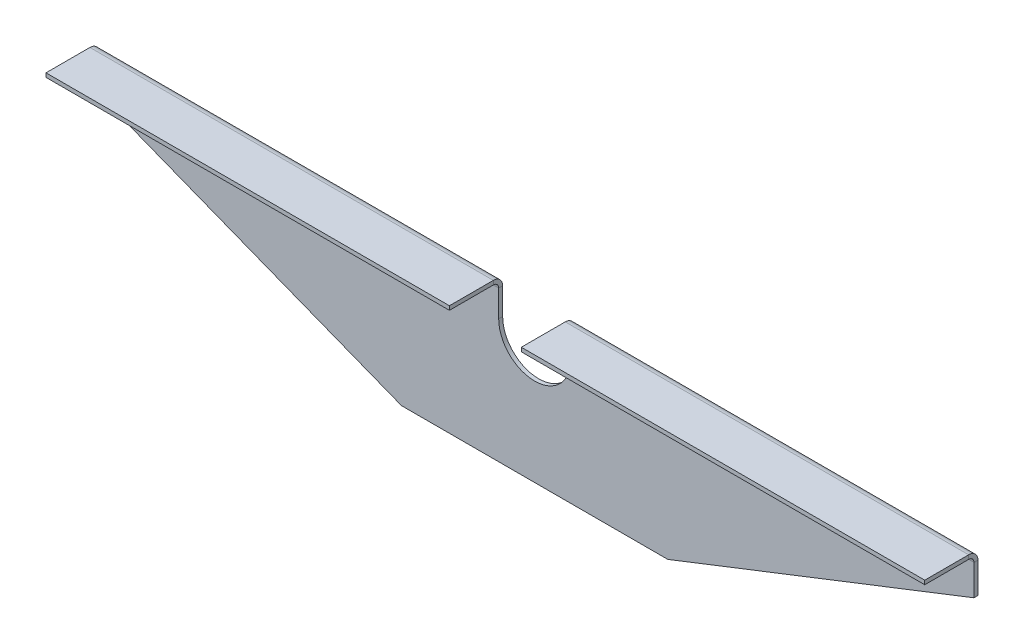
ISO-10303-21;
HEADER;
FILE_DESCRIPTION(('STEP AP214'),'2;1');
FILE_NAME('part.step','',(''),(''),'','','');
FILE_SCHEMA(('AUTOMOTIVE_DESIGN { 1 0 10303 214 1 1 1 1 }'));
ENDSEC;
DATA;
#1=APPLICATION_CONTEXT('core data for automotive mechanical design processes');
#2=APPLICATION_PROTOCOL_DEFINITION('international standard','automotive_design',2000,#1);
#3=PRODUCT_CONTEXT('',#1,'mechanical');
#4=PRODUCT('Part','Part','',(#3));
#5=PRODUCT_RELATED_PRODUCT_CATEGORY('part','',(#4));
#6=PRODUCT_DEFINITION_FORMATION('','',#4);
#7=PRODUCT_DEFINITION_CONTEXT('part definition',#1,'design');
#8=PRODUCT_DEFINITION('design','',#6,#7);
#9=PRODUCT_DEFINITION_SHAPE('','',#8);
#10=(LENGTH_UNIT() NAMED_UNIT(*) SI_UNIT(.MILLI.,.METRE.));
#11=(NAMED_UNIT(*) PLANE_ANGLE_UNIT() SI_UNIT($,.RADIAN.));
#12=(NAMED_UNIT(*) SI_UNIT($,.STERADIAN.) SOLID_ANGLE_UNIT());
#13=UNCERTAINTY_MEASURE_WITH_UNIT(LENGTH_MEASURE(1.E-05),#10,'distance_accuracy_value','');
#14=(GEOMETRIC_REPRESENTATION_CONTEXT(3) GLOBAL_UNCERTAINTY_ASSIGNED_CONTEXT((#13)) GLOBAL_UNIT_ASSIGNED_CONTEXT((#10,
#11,#12)) REPRESENTATION_CONTEXT('',''));
#15=CARTESIAN_POINT('',(0.,0.,0.));
#16=DIRECTION('',(0.,0.,1.));
#17=DIRECTION('',(1.,0.,0.));
#18=AXIS2_PLACEMENT_3D('',#15,#16,#17);
#19=CARTESIAN_POINT('',(-13.5,-3.50000000000003,-10.));
#20=DIRECTION('',(1.,0.,0.));
#21=DIRECTION('',(0.,0.,-1.));
#22=AXIS2_PLACEMENT_3D('',#19,#20,#21);
#23=PLANE('',#22);
#24=DIRECTION('',(0.,0.,-1.));
#25=VECTOR('',#24,1.);
#26=CARTESIAN_POINT('',(-13.5,8.49999999999998,0.));
#27=LINE('',#26,#25);
#28=CARTESIAN_POINT('',(-13.5,8.50000000000004,18.5));
#29=VERTEX_POINT('',#28);
#30=CARTESIAN_POINT('',(-13.5,8.49999999999999,2.));
#31=VERTEX_POINT('',#30);
#32=EDGE_CURVE('E479',#29,#31,#27,.T.);
#33=ORIENTED_EDGE('',*,*,#32,.T.);
#34=DIRECTION('',(0.,1.,0.));
#35=VECTOR('',#34,1.);
#36=CARTESIAN_POINT('',(-13.5,8.49999999999999,2.));
#37=LINE('',#36,#35);
#38=CARTESIAN_POINT('',(-13.5,9.99999999999998,2.));
#39=VERTEX_POINT('',#38);
#40=EDGE_CURVE('E13',#31,#39,#37,.T.);
#41=ORIENTED_EDGE('',*,*,#40,.T.);
#42=DIRECTION('',(0.,0.,-1.));
#43=VECTOR('',#42,1.);
#44=CARTESIAN_POINT('',(-13.5,9.99999999999998,0.));
#45=LINE('',#44,#43);
#46=CARTESIAN_POINT('',(-13.5,10.,18.5));
#47=VERTEX_POINT('',#46);
#48=EDGE_CURVE('E154',#47,#39,#45,.T.);
#49=ORIENTED_EDGE('',*,*,#48,.F.);
#50=DIRECTION('',(0.,1.,0.));
#51=VECTOR('',#50,1.);
#52=CARTESIAN_POINT('',(-13.5,10.,18.5));
#53=LINE('',#52,#51);
#54=EDGE_CURVE('E444',#29,#47,#53,.T.);
#55=ORIENTED_EDGE('',*,*,#54,.F.);
#56=EDGE_LOOP('',(#33,#41,#49,#55));
#57=FACE_BOUND('',#56,.T.);
#58=ADVANCED_FACE('F139',(#57),#23,.T.);
#59=DIRECTION('',(0.,-1.,0.));
#60=VECTOR('',#59,1.);
#61=CARTESIAN_POINT('',(-13.5,0.,-1.50000000000006));
#62=LINE('',#61,#60);
#63=CARTESIAN_POINT('',(-13.5,6.49999999999999,-1.50000000000006));
#64=VERTEX_POINT('',#63);
#65=CARTESIAN_POINT('',(-13.5,-3.50000000000003,-1.50000000000006));
#66=VERTEX_POINT('',#65);
#67=EDGE_CURVE('E282',#64,#66,#62,.T.);
#68=ORIENTED_EDGE('',*,*,#67,.F.);
#69=DIRECTION('',(0.,0.,1.));
#70=VECTOR('',#69,1.);
#71=CARTESIAN_POINT('',(-13.5,6.49999999999999,-1.50000000000006));
#72=LINE('',#71,#70);
#73=CARTESIAN_POINT('',(-13.5,6.49999999999999,0.));
#74=VERTEX_POINT('',#73);
#75=EDGE_CURVE('E148',#64,#74,#72,.T.);
#76=ORIENTED_EDGE('',*,*,#75,.T.);
#77=DIRECTION('',(0.,-1.,0.));
#78=VECTOR('',#77,1.);
#79=CARTESIAN_POINT('',(-13.5,0.,0.));
#80=LINE('',#79,#78);
#81=CARTESIAN_POINT('',(-13.5,-3.50000000000003,0.));
#82=VERTEX_POINT('',#81);
#83=EDGE_CURVE('E285',#74,#82,#80,.T.);
#84=ORIENTED_EDGE('',*,*,#83,.T.);
#85=DIRECTION('',(0.,0.,1.));
#86=VECTOR('',#85,1.);
#87=CARTESIAN_POINT('',(-13.5,-3.50000000000003,-10.));
#88=LINE('',#87,#86);
#89=EDGE_CURVE('E270',#66,#82,#88,.T.);
#90=ORIENTED_EDGE('',*,*,#89,.F.);
#91=EDGE_LOOP('',(#68,#76,#84,#90));
#92=FACE_BOUND('',#91,.T.);
#93=ADVANCED_FACE('F281',(#92),#23,.T.);
#94=CARTESIAN_POINT('',(13.5,-3.50000000000002,-10.));
#95=DIRECTION('',(1.,0.,0.));
#96=DIRECTION('',(0.,0.,-1.));
#97=AXIS2_PLACEMENT_3D('',#94,#95,#96);
#98=PLANE('',#97);
#99=DIRECTION('',(0.,0.,-1.));
#100=VECTOR('',#99,1.);
#101=CARTESIAN_POINT('',(13.5,9.99999999999998,0.));
#102=LINE('',#101,#100);
#103=CARTESIAN_POINT('',(13.5,10.,18.5));
#104=VERTEX_POINT('',#103);
#105=CARTESIAN_POINT('',(13.5,9.99999999999998,2.));
#106=VERTEX_POINT('',#105);
#107=EDGE_CURVE('E312',#104,#106,#102,.T.);
#108=ORIENTED_EDGE('',*,*,#107,.T.);
#109=DIRECTION('',(0.,-1.,0.));
#110=VECTOR('',#109,1.);
#111=CARTESIAN_POINT('',(13.5,9.99999999999998,2.));
#112=LINE('',#111,#110);
#113=CARTESIAN_POINT('',(13.5,8.49999999999998,2.));
#114=VERTEX_POINT('',#113);
#115=EDGE_CURVE('E465',#106,#114,#112,.T.);
#116=ORIENTED_EDGE('',*,*,#115,.T.);
#117=DIRECTION('',(0.,0.,-1.));
#118=VECTOR('',#117,1.);
#119=CARTESIAN_POINT('',(13.5,8.49999999999998,0.));
#120=LINE('',#119,#118);
#121=CARTESIAN_POINT('',(13.5,8.50000000000004,18.5));
#122=VERTEX_POINT('',#121);
#123=EDGE_CURVE('E293',#122,#114,#120,.T.);
#124=ORIENTED_EDGE('',*,*,#123,.F.);
#125=DIRECTION('',(0.,1.,0.));
#126=VECTOR('',#125,1.);
#127=CARTESIAN_POINT('',(13.5,10.,18.5));
#128=LINE('',#127,#126);
#129=EDGE_CURVE('E456',#122,#104,#128,.T.);
#130=ORIENTED_EDGE('',*,*,#129,.T.);
#131=EDGE_LOOP('',(#108,#116,#124,#130));
#132=FACE_BOUND('',#131,.T.);
#133=ADVANCED_FACE('F624',(#132),#98,.F.);
#134=DIRECTION('',(0.,-1.,0.));
#135=VECTOR('',#134,1.);
#136=CARTESIAN_POINT('',(13.5,0.,0.));
#137=LINE('',#136,#135);
#138=CARTESIAN_POINT('',(13.5,6.49999999999998,0.));
#139=VERTEX_POINT('',#138);
#140=CARTESIAN_POINT('',(13.5,-3.50000000000003,0.));
#141=VERTEX_POINT('',#140);
#142=EDGE_CURVE('E308',#139,#141,#137,.T.);
#143=ORIENTED_EDGE('',*,*,#142,.F.);
#144=DIRECTION('',(0.,0.,-1.));
#145=VECTOR('',#144,1.);
#146=CARTESIAN_POINT('',(13.5,6.49999999999998,0.));
#147=LINE('',#146,#145);
#148=CARTESIAN_POINT('',(13.5,6.49999999999998,-1.50000000000006));
#149=VERTEX_POINT('',#148);
#150=EDGE_CURVE('E462',#139,#149,#147,.T.);
#151=ORIENTED_EDGE('',*,*,#150,.T.);
#152=DIRECTION('',(0.,-1.,0.));
#153=VECTOR('',#152,1.);
#154=CARTESIAN_POINT('',(13.5,0.,-1.50000000000006));
#155=LINE('',#154,#153);
#156=CARTESIAN_POINT('',(13.5,-3.50000000000003,-1.50000000000006));
#157=VERTEX_POINT('',#156);
#158=EDGE_CURVE('E277',#149,#157,#155,.T.);
#159=ORIENTED_EDGE('',*,*,#158,.T.);
#160=DIRECTION('',(0.,0.,1.));
#161=VECTOR('',#160,1.);
#162=CARTESIAN_POINT('',(13.5,-3.50000000000002,-10.));
#163=LINE('',#162,#161);
#164=EDGE_CURVE('E273',#157,#141,#163,.T.);
#165=ORIENTED_EDGE('',*,*,#164,.T.);
#166=EDGE_LOOP('',(#143,#151,#159,#165));
#167=FACE_BOUND('',#166,.T.);
#168=ADVANCED_FACE('F575',(#167),#98,.F.);
#169=CARTESIAN_POINT('',(-165.,6.49999999999999,2.));
#170=DIRECTION('',(-1.,0.,0.));
#171=DIRECTION('',(0.,1.,0.));
#172=AXIS2_PLACEMENT_3D('',#169,#170,#171);
#173=CYLINDRICAL_SURFACE('',#172,3.5);
#174=DIRECTION('',(-1.,0.,0.));
#175=VECTOR('',#174,1.);
#176=CARTESIAN_POINT('',(0.,9.99999999999998,2.));
#177=LINE('',#176,#175);
#178=CARTESIAN_POINT('',(-165.,9.99999999999998,2.));
#179=VERTEX_POINT('',#178);
#180=EDGE_CURVE('E359',#39,#179,#177,.T.);
#181=ORIENTED_EDGE('',*,*,#180,.F.);
#182=CARTESIAN_POINT('',(-13.5,6.49999999999999,2.));
#183=DIRECTION('',(1.,0.,0.));
#184=DIRECTION('',(0.,0.,-1.));
#185=AXIS2_PLACEMENT_3D('',#182,#183,#184);
#186=CIRCLE('',#185,3.5);
#187=EDGE_CURVE('E294',#39,#64,#186,.F.);
#188=ORIENTED_EDGE('',*,*,#187,.T.);
#189=DIRECTION('',(-1.,0.,0.));
#190=VECTOR('',#189,1.);
#191=CARTESIAN_POINT('',(-165.,6.49999999999999,-1.50000000000006));
#192=LINE('',#191,#190);
#193=CARTESIAN_POINT('',(-165.,6.49999999999999,-1.50000000000006));
#194=VERTEX_POINT('',#193);
#195=EDGE_CURVE('E291',#194,#64,#192,.F.);
#196=ORIENTED_EDGE('',*,*,#195,.F.);
#197=CARTESIAN_POINT('',(-165.,6.49999999999999,2.));
#198=DIRECTION('',(-1.,0.,0.));
#199=DIRECTION('',(0.,0.,1.));
#200=AXIS2_PLACEMENT_3D('',#197,#198,#199);
#201=CIRCLE('',#200,3.5);
#202=EDGE_CURVE('E379',#179,#194,#201,.T.);
#203=ORIENTED_EDGE('',*,*,#202,.F.);
#204=EDGE_LOOP('',(#181,#188,#196,#203));
#205=FACE_BOUND('',#204,.T.);
#206=ADVANCED_FACE('F509',(#205),#173,.T.);
#207=CARTESIAN_POINT('',(-165.,6.49999999999999,2.));
#208=DIRECTION('',(-1.,0.,0.));
#209=DIRECTION('',(0.,1.,0.));
#210=AXIS2_PLACEMENT_3D('',#207,#208,#209);
#211=CYLINDRICAL_SURFACE('',#210,2.);
#212=CARTESIAN_POINT('',(-13.5,6.49999999999999,2.));
#213=DIRECTION('',(1.,0.,0.));
#214=DIRECTION('',(0.,0.,-1.));
#215=AXIS2_PLACEMENT_3D('',#212,#213,#214);
#216=CIRCLE('',#215,2.);
#217=EDGE_CURVE('E473',#31,#74,#216,.F.);
#218=ORIENTED_EDGE('',*,*,#217,.F.);
#219=DIRECTION('',(1.,0.,0.));
#220=VECTOR('',#219,1.);
#221=CARTESIAN_POINT('',(165.,8.49999999999998,2.));
#222=LINE('',#221,#220);
#223=CARTESIAN_POINT('',(-165.,8.49999999999998,2.));
#224=VERTEX_POINT('',#223);
#225=EDGE_CURVE('E368',#31,#224,#222,.F.);
#226=ORIENTED_EDGE('',*,*,#225,.T.);
#227=CARTESIAN_POINT('',(-165.,6.49999999999999,2.));
#228=DIRECTION('',(-1.,0.,0.));
#229=DIRECTION('',(0.,0.,1.));
#230=AXIS2_PLACEMENT_3D('',#227,#228,#229);
#231=CIRCLE('',#230,2.);
#232=CARTESIAN_POINT('',(-165.,6.49999999999999,0.));
#233=VERTEX_POINT('',#232);
#234=EDGE_CURVE('E326',#224,#233,#231,.T.);
#235=ORIENTED_EDGE('',*,*,#234,.T.);
#236=DIRECTION('',(-1.,0.,0.));
#237=VECTOR('',#236,1.);
#238=CARTESIAN_POINT('',(-165.,6.49999999999999,0.));
#239=LINE('',#238,#237);
#240=EDGE_CURVE('E387',#233,#74,#239,.F.);
#241=ORIENTED_EDGE('',*,*,#240,.T.);
#242=EDGE_LOOP('',(#218,#226,#235,#241));
#243=FACE_BOUND('',#242,.T.);
#244=ADVANCED_FACE('F488',(#243),#211,.F.);
#245=CARTESIAN_POINT('',(0.,9.99999999999998,0.));
#246=DIRECTION('',(0.,1.,0.));
#247=DIRECTION('',(0.,0.,1.));
#248=AXIS2_PLACEMENT_3D('',#245,#246,#247);
#249=PLANE('',#248);
#250=DIRECTION('',(-1.,0.,0.));
#251=VECTOR('',#250,1.);
#252=CARTESIAN_POINT('',(-165.,10.,18.5));
#253=LINE('',#252,#251);
#254=CARTESIAN_POINT('',(-165.,10.,18.5));
#255=VERTEX_POINT('',#254);
#256=EDGE_CURVE('E339',#47,#255,#253,.T.);
#257=ORIENTED_EDGE('',*,*,#256,.F.);
#258=ORIENTED_EDGE('',*,*,#48,.T.);
#259=ORIENTED_EDGE('',*,*,#180,.T.);
#260=DIRECTION('',(0.,0.,-1.));
#261=VECTOR('',#260,1.);
#262=CARTESIAN_POINT('',(-165.,9.99999999999998,0.));
#263=LINE('',#262,#261);
#264=EDGE_CURVE('E331',#255,#179,#263,.T.);
#265=ORIENTED_EDGE('',*,*,#264,.F.);
#266=EDGE_LOOP('',(#257,#258,#259,#265));
#267=FACE_BOUND('',#266,.T.);
#268=ADVANCED_FACE('F504',(#267),#249,.T.);
#269=CARTESIAN_POINT('',(0.,8.49999999999998,0.));
#270=DIRECTION('',(0.,1.,0.));
#271=DIRECTION('',(0.,0.,1.));
#272=AXIS2_PLACEMENT_3D('',#269,#270,#271);
#273=PLANE('',#272);
#274=ORIENTED_EDGE('',*,*,#32,.F.);
#275=DIRECTION('',(1.,0.,0.));
#276=VECTOR('',#275,1.);
#277=CARTESIAN_POINT('',(0.,8.50000000000004,18.5));
#278=LINE('',#277,#276);
#279=CARTESIAN_POINT('',(-165.,8.50000000000004,18.5));
#280=VERTEX_POINT('',#279);
#281=EDGE_CURVE('E351',#29,#280,#278,.F.);
#282=ORIENTED_EDGE('',*,*,#281,.T.);
#283=DIRECTION('',(0.,0.,1.));
#284=VECTOR('',#283,1.);
#285=CARTESIAN_POINT('',(-165.,8.49999999999998,0.));
#286=LINE('',#285,#284);
#287=EDGE_CURVE('E343',#280,#224,#286,.F.);
#288=ORIENTED_EDGE('',*,*,#287,.T.);
#289=ORIENTED_EDGE('',*,*,#225,.F.);
#290=EDGE_LOOP('',(#274,#282,#288,#289));
#291=FACE_BOUND('',#290,.T.);
#292=ADVANCED_FACE('F496',(#291),#273,.F.);
#293=CARTESIAN_POINT('',(-165.,10.,18.5));
#294=DIRECTION('',(0.,0.,1.));
#295=DIRECTION('',(0.,-1.,0.));
#296=AXIS2_PLACEMENT_3D('',#293,#294,#295);
#297=PLANE('',#296);
#298=ORIENTED_EDGE('',*,*,#281,.F.);
#299=ORIENTED_EDGE('',*,*,#54,.T.);
#300=ORIENTED_EDGE('',*,*,#256,.T.);
#301=DIRECTION('',(0.,-1.,0.));
#302=VECTOR('',#301,1.);
#303=CARTESIAN_POINT('',(-165.,10.,18.5));
#304=LINE('',#303,#302);
#305=EDGE_CURVE('E322',#255,#280,#304,.T.);
#306=ORIENTED_EDGE('',*,*,#305,.T.);
#307=EDGE_LOOP('',(#298,#299,#300,#306));
#308=FACE_BOUND('',#307,.T.);
#309=ADVANCED_FACE('F562',(#308),#297,.T.);
#310=CARTESIAN_POINT('',(-165.,-5.00000000000002,-1.50000000000006));
#311=DIRECTION('',(-1.,0.,0.));
#312=DIRECTION('',(0.,0.,1.));
#313=AXIS2_PLACEMENT_3D('',#310,#311,#312);
#314=PLANE('',#313);
#315=DIRECTION('',(0.,-1.,0.));
#316=VECTOR('',#315,1.);
#317=CARTESIAN_POINT('',(-165.,-5.00000000000002,0.));
#318=LINE('',#317,#316);
#319=CARTESIAN_POINT('',(-165.,-5.00000000000002,0.));
#320=VERTEX_POINT('',#319);
#321=EDGE_CURVE('E399',#233,#320,#318,.T.);
#322=ORIENTED_EDGE('',*,*,#321,.F.);
#323=DIRECTION('',(0.,0.,-1.));
#324=VECTOR('',#323,1.);
#325=CARTESIAN_POINT('',(-165.,6.49999999999999,0.));
#326=LINE('',#325,#324);
#327=EDGE_CURVE('E378',#233,#194,#326,.T.);
#328=ORIENTED_EDGE('',*,*,#327,.T.);
#329=DIRECTION('',(0.,-1.,0.));
#330=VECTOR('',#329,1.);
#331=CARTESIAN_POINT('',(-165.,-5.00000000000002,-1.50000000000006));
#332=LINE('',#331,#330);
#333=CARTESIAN_POINT('',(-165.,-5.00000000000002,-1.50000000000006));
#334=VERTEX_POINT('',#333);
#335=EDGE_CURVE('E403',#194,#334,#332,.T.);
#336=ORIENTED_EDGE('',*,*,#335,.T.);
#337=DIRECTION('',(0.,0.,1.));
#338=VECTOR('',#337,1.);
#339=CARTESIAN_POINT('',(-165.,-5.00000000000002,-1.50000000000006));
#340=LINE('',#339,#338);
#341=EDGE_CURVE('E423',#334,#320,#340,.T.);
#342=ORIENTED_EDGE('',*,*,#341,.T.);
#343=EDGE_LOOP('',(#322,#328,#336,#342));
#344=FACE_BOUND('',#343,.T.);
#345=ADVANCED_FACE('F141',(#344),#314,.T.);
#346=CARTESIAN_POINT('',(0.,0.,-1.50000000000006));
#347=DIRECTION('',(0.,0.,-1.));
#348=DIRECTION('',(-1.,0.,0.));
#349=AXIS2_PLACEMENT_3D('',#346,#347,#348);
#350=PLANE('',#349);
#351=ORIENTED_EDGE('',*,*,#158,.F.);
#352=CARTESIAN_POINT('',(165.,6.49999999999997,-1.50000000000006));
#353=VERTEX_POINT('',#352);
#354=EDGE_CURVE('E162',#149,#353,#192,.F.);
#355=ORIENTED_EDGE('',*,*,#354,.T.);
#356=DIRECTION('',(0.,1.,0.));
#357=VECTOR('',#356,1.);
#358=CARTESIAN_POINT('',(165.,9.99999999999998,-1.50000000000006));
#359=LINE('',#358,#357);
#360=CARTESIAN_POINT('',(165.,-5.00000000000003,-1.50000000000006));
#361=VERTEX_POINT('',#360);
#362=EDGE_CURVE('E419',#361,#353,#359,.T.);
#363=ORIENTED_EDGE('',*,*,#362,.F.);
#364=DIRECTION('',(0.931242779705753,0.364399348580512,0.));
#365=VECTOR('',#364,1.);
#366=CARTESIAN_POINT('',(165.,-5.00000000000003,-1.50000000000006));
#367=LINE('',#366,#365);
#368=CARTESIAN_POINT('',(50.,-50.,-1.50000000000006));
#369=VERTEX_POINT('',#368);
#370=EDGE_CURVE('E415',#369,#361,#367,.T.);
#371=ORIENTED_EDGE('',*,*,#370,.F.);
#372=DIRECTION('',(1.,0.,0.));
#373=VECTOR('',#372,1.);
#374=CARTESIAN_POINT('',(50.,-50.,-1.50000000000006));
#375=LINE('',#374,#373);
#376=CARTESIAN_POINT('',(-50.,-50.,-1.50000000000006));
#377=VERTEX_POINT('',#376);
#378=EDGE_CURVE('E411',#377,#369,#375,.T.);
#379=ORIENTED_EDGE('',*,*,#378,.F.);
#380=DIRECTION('',(0.931242779705753,-0.364399348580512,0.));
#381=VECTOR('',#380,1.);
#382=CARTESIAN_POINT('',(-50.,-50.,-1.50000000000006));
#383=LINE('',#382,#381);
#384=EDGE_CURVE('E406',#334,#377,#383,.T.);
#385=ORIENTED_EDGE('',*,*,#384,.F.);
#386=ORIENTED_EDGE('',*,*,#335,.F.);
#387=ORIENTED_EDGE('',*,*,#195,.T.);
#388=ORIENTED_EDGE('',*,*,#67,.T.);
#389=CARTESIAN_POINT('',(0.,-3.50000000000003,-1.50000000000006));
#390=DIRECTION('',(0.,0.,-1.));
#391=DIRECTION('',(-1.,0.,0.));
#392=AXIS2_PLACEMENT_3D('',#389,#390,#391);
#393=CIRCLE('',#392,13.5);
#394=EDGE_CURVE('E267',#157,#66,#393,.T.);
#395=ORIENTED_EDGE('',*,*,#394,.F.);
#396=EDGE_LOOP('',(#351,#355,#363,#371,#379,#385,#386,#387,#388,#395));
#397=FACE_BOUND('',#396,.T.);
#398=ADVANCED_FACE('F289',(#397),#350,.T.);
#399=CARTESIAN_POINT('',(0.,0.,0.));
#400=DIRECTION('',(0.,0.,-1.));
#401=DIRECTION('',(-1.,0.,0.));
#402=AXIS2_PLACEMENT_3D('',#399,#400,#401);
#403=PLANE('',#402);
#404=CARTESIAN_POINT('',(165.,6.49999999999997,0.));
#405=VERTEX_POINT('',#404);
#406=EDGE_CURVE('E391',#139,#405,#239,.F.);
#407=ORIENTED_EDGE('',*,*,#406,.F.);
#408=ORIENTED_EDGE('',*,*,#142,.T.);
#409=CARTESIAN_POINT('',(0.,-3.50000000000003,0.));
#410=DIRECTION('',(0.,0.,-1.));
#411=DIRECTION('',(-1.,0.,0.));
#412=AXIS2_PLACEMENT_3D('',#409,#410,#411);
#413=CIRCLE('',#412,13.5);
#414=EDGE_CURVE('E459',#141,#82,#413,.T.);
#415=ORIENTED_EDGE('',*,*,#414,.T.);
#416=ORIENTED_EDGE('',*,*,#83,.F.);
#417=ORIENTED_EDGE('',*,*,#240,.F.);
#418=ORIENTED_EDGE('',*,*,#321,.T.);
#419=DIRECTION('',(0.931242779705753,-0.364399348580512,0.));
#420=VECTOR('',#419,1.);
#421=CARTESIAN_POINT('',(-50.,-50.,0.));
#422=LINE('',#421,#420);
#423=CARTESIAN_POINT('',(-50.,-50.,0.));
#424=VERTEX_POINT('',#423);
#425=EDGE_CURVE('E426',#320,#424,#422,.T.);
#426=ORIENTED_EDGE('',*,*,#425,.T.);
#427=DIRECTION('',(1.,0.,0.));
#428=VECTOR('',#427,1.);
#429=CARTESIAN_POINT('',(50.,-50.,0.));
#430=LINE('',#429,#428);
#431=CARTESIAN_POINT('',(50.,-50.,0.));
#432=VERTEX_POINT('',#431);
#433=EDGE_CURVE('E430',#424,#432,#430,.T.);
#434=ORIENTED_EDGE('',*,*,#433,.T.);
#435=DIRECTION('',(0.931242779705753,0.364399348580512,0.));
#436=VECTOR('',#435,1.);
#437=CARTESIAN_POINT('',(165.,-5.00000000000003,0.));
#438=LINE('',#437,#436);
#439=CARTESIAN_POINT('',(165.,-5.00000000000003,0.));
#440=VERTEX_POINT('',#439);
#441=EDGE_CURVE('E434',#432,#440,#438,.T.);
#442=ORIENTED_EDGE('',*,*,#441,.T.);
#443=DIRECTION('',(0.,1.,0.));
#444=VECTOR('',#443,1.);
#445=CARTESIAN_POINT('',(165.,9.99999999999998,0.));
#446=LINE('',#445,#444);
#447=EDGE_CURVE('E407',#440,#405,#446,.T.);
#448=ORIENTED_EDGE('',*,*,#447,.T.);
#449=EDGE_LOOP('',(#407,#408,#415,#416,#417,#418,#426,#434,#442,#448));
#450=FACE_BOUND('',#449,.T.);
#451=ADVANCED_FACE('F484',(#450),#403,.F.);
#452=CARTESIAN_POINT('',(165.,9.99999999999998,-1.50000000000006));
#453=DIRECTION('',(1.,0.,0.));
#454=DIRECTION('',(0.,1.,0.));
#455=AXIS2_PLACEMENT_3D('',#452,#453,#454);
#456=PLANE('',#455);
#457=DIRECTION('',(0.,0.,-1.));
#458=VECTOR('',#457,1.);
#459=CARTESIAN_POINT('',(165.,6.49999999999997,0.));
#460=LINE('',#459,#458);
#461=EDGE_CURVE('E395',#405,#353,#460,.T.);
#462=ORIENTED_EDGE('',*,*,#461,.F.);
#463=ORIENTED_EDGE('',*,*,#447,.F.);
#464=DIRECTION('',(0.,0.,1.));
#465=VECTOR('',#464,1.);
#466=CARTESIAN_POINT('',(165.,-5.00000000000003,-1.50000000000006));
#467=LINE('',#466,#465);
#468=EDGE_CURVE('E441',#361,#440,#467,.T.);
#469=ORIENTED_EDGE('',*,*,#468,.F.);
#470=ORIENTED_EDGE('',*,*,#362,.T.);
#471=EDGE_LOOP('',(#462,#463,#469,#470));
#472=FACE_BOUND('',#471,.T.);
#473=ADVANCED_FACE('F527',(#472),#456,.T.);
#474=CARTESIAN_POINT('',(165.,-5.00000000000003,-1.50000000000006));
#475=DIRECTION('',(0.364399348580512,-0.931242779705753,0.));
#476=DIRECTION('',(0.931242779705754,0.364399348580512,0.));
#477=AXIS2_PLACEMENT_3D('',#474,#475,#476);
#478=PLANE('',#477);
#479=ORIENTED_EDGE('',*,*,#441,.F.);
#480=DIRECTION('',(0.,0.,1.));
#481=VECTOR('',#480,1.);
#482=CARTESIAN_POINT('',(50.,-50.,-1.50000000000006));
#483=LINE('',#482,#481);
#484=EDGE_CURVE('E445',#369,#432,#483,.T.);
#485=ORIENTED_EDGE('',*,*,#484,.F.);
#486=ORIENTED_EDGE('',*,*,#370,.T.);
#487=ORIENTED_EDGE('',*,*,#468,.T.);
#488=EDGE_LOOP('',(#479,#485,#486,#487));
#489=FACE_BOUND('',#488,.T.);
#490=ADVANCED_FACE('F523',(#489),#478,.T.);
#491=CARTESIAN_POINT('',(50.,-50.,-1.50000000000006));
#492=DIRECTION('',(0.,-1.,0.));
#493=DIRECTION('',(0.,0.,-1.));
#494=AXIS2_PLACEMENT_3D('',#491,#492,#493);
#495=PLANE('',#494);
#496=ORIENTED_EDGE('',*,*,#433,.F.);
#497=DIRECTION('',(0.,0.,1.));
#498=VECTOR('',#497,1.);
#499=CARTESIAN_POINT('',(-50.,-50.,-1.50000000000006));
#500=LINE('',#499,#498);
#501=EDGE_CURVE('E448',#377,#424,#500,.T.);
#502=ORIENTED_EDGE('',*,*,#501,.F.);
#503=ORIENTED_EDGE('',*,*,#378,.T.);
#504=ORIENTED_EDGE('',*,*,#484,.T.);
#505=EDGE_LOOP('',(#496,#502,#503,#504));
#506=FACE_BOUND('',#505,.T.);
#507=ADVANCED_FACE('F521',(#506),#495,.T.);
#508=CARTESIAN_POINT('',(-50.,-50.,-1.50000000000006));
#509=DIRECTION('',(-0.364399348580512,-0.931242779705753,0.));
#510=DIRECTION('',(0.931242779705754,-0.364399348580512,0.));
#511=AXIS2_PLACEMENT_3D('',#508,#509,#510);
#512=PLANE('',#511);
#513=ORIENTED_EDGE('',*,*,#425,.F.);
#514=ORIENTED_EDGE('',*,*,#341,.F.);
#515=ORIENTED_EDGE('',*,*,#384,.T.);
#516=ORIENTED_EDGE('',*,*,#501,.T.);
#517=EDGE_LOOP('',(#513,#514,#515,#516));
#518=FACE_BOUND('',#517,.T.);
#519=ADVANCED_FACE('F517',(#518),#512,.T.);
#520=CARTESIAN_POINT('',(165.,6.49999999999997,2.));
#521=DIRECTION('',(1.,0.,0.));
#522=DIRECTION('',(0.,0.,-1.));
#523=AXIS2_PLACEMENT_3D('',#520,#521,#522);
#524=PLANE('',#523);
#525=DIRECTION('',(0.,1.,0.));
#526=VECTOR('',#525,1.);
#527=CARTESIAN_POINT('',(165.,9.99999999999998,2.));
#528=LINE('',#527,#526);
#529=CARTESIAN_POINT('',(165.,8.49999999999998,2.));
#530=VERTEX_POINT('',#529);
#531=CARTESIAN_POINT('',(165.,9.99999999999998,2.));
#532=VERTEX_POINT('',#531);
#533=EDGE_CURVE('E276',#530,#532,#528,.T.);
#534=ORIENTED_EDGE('',*,*,#533,.F.);
#535=CARTESIAN_POINT('',(165.,6.49999999999997,2.));
#536=DIRECTION('',(-1.,0.,0.));
#537=DIRECTION('',(0.,0.,1.));
#538=AXIS2_PLACEMENT_3D('',#535,#536,#537);
#539=CIRCLE('',#538,2.);
#540=EDGE_CURVE('E383',#405,#530,#539,.F.);
#541=ORIENTED_EDGE('',*,*,#540,.F.);
#542=ORIENTED_EDGE('',*,*,#461,.T.);
#543=CARTESIAN_POINT('',(165.,6.49999999999997,2.));
#544=DIRECTION('',(-1.,0.,0.));
#545=DIRECTION('',(0.,0.,1.));
#546=AXIS2_PLACEMENT_3D('',#543,#544,#545);
#547=CIRCLE('',#546,3.5);
#548=EDGE_CURVE('E374',#353,#532,#547,.F.);
#549=ORIENTED_EDGE('',*,*,#548,.T.);
#550=EDGE_LOOP('',(#534,#541,#542,#549));
#551=FACE_BOUND('',#550,.T.);
#552=ADVANCED_FACE('F607',(#551),#524,.T.);
#553=CARTESIAN_POINT('',(-165.,6.49999999999999,2.));
#554=DIRECTION('',(1.,0.,0.));
#555=DIRECTION('',(0.,0.,-1.));
#556=AXIS2_PLACEMENT_3D('',#553,#554,#555);
#557=PLANE('',#556);
#558=ORIENTED_EDGE('',*,*,#234,.F.);
#559=DIRECTION('',(0.,1.,0.));
#560=VECTOR('',#559,1.);
#561=CARTESIAN_POINT('',(-165.,8.49999999999998,2.));
#562=LINE('',#561,#560);
#563=EDGE_CURVE('E360',#224,#179,#562,.T.);
#564=ORIENTED_EDGE('',*,*,#563,.T.);
#565=ORIENTED_EDGE('',*,*,#202,.T.);
#566=ORIENTED_EDGE('',*,*,#327,.F.);
#567=EDGE_LOOP('',(#558,#564,#565,#566));
#568=FACE_BOUND('',#567,.T.);
#569=ADVANCED_FACE('F491',(#568),#557,.F.);
#570=CARTESIAN_POINT('',(13.5,6.49999999999998,2.));
#571=DIRECTION('',(1.,0.,0.));
#572=DIRECTION('',(0.,0.,-1.));
#573=AXIS2_PLACEMENT_3D('',#570,#571,#572);
#574=CIRCLE('',#573,3.5);
#575=EDGE_CURVE('E316',#106,#149,#574,.F.);
#576=ORIENTED_EDGE('',*,*,#575,.F.);
#577=EDGE_CURVE('E355',#532,#106,#177,.T.);
#578=ORIENTED_EDGE('',*,*,#577,.F.);
#579=ORIENTED_EDGE('',*,*,#548,.F.);
#580=ORIENTED_EDGE('',*,*,#354,.F.);
#581=EDGE_LOOP('',(#576,#578,#579,#580));
#582=FACE_BOUND('',#581,.T.);
#583=ADVANCED_FACE('F578',(#582),#173,.T.);
#584=EDGE_CURVE('E364',#530,#114,#222,.F.);
#585=ORIENTED_EDGE('',*,*,#584,.T.);
#586=CARTESIAN_POINT('',(13.5,6.49999999999998,2.));
#587=DIRECTION('',(1.,0.,0.));
#588=DIRECTION('',(0.,0.,-1.));
#589=AXIS2_PLACEMENT_3D('',#586,#587,#588);
#590=CIRCLE('',#589,2.);
#591=EDGE_CURVE('E300',#114,#139,#590,.F.);
#592=ORIENTED_EDGE('',*,*,#591,.T.);
#593=ORIENTED_EDGE('',*,*,#406,.T.);
#594=ORIENTED_EDGE('',*,*,#540,.T.);
#595=EDGE_LOOP('',(#585,#592,#593,#594));
#596=FACE_BOUND('',#595,.T.);
#597=ADVANCED_FACE('F609',(#596),#211,.F.);
#598=CARTESIAN_POINT('',(-165.,9.99999999999998,0.));
#599=DIRECTION('',(-1.,0.,0.));
#600=DIRECTION('',(0.,0.,1.));
#601=AXIS2_PLACEMENT_3D('',#598,#599,#600);
#602=PLANE('',#601);
#603=ORIENTED_EDGE('',*,*,#264,.T.);
#604=ORIENTED_EDGE('',*,*,#563,.F.);
#605=ORIENTED_EDGE('',*,*,#287,.F.);
#606=ORIENTED_EDGE('',*,*,#305,.F.);
#607=EDGE_LOOP('',(#603,#604,#605,#606));
#608=FACE_BOUND('',#607,.T.);
#609=ADVANCED_FACE('F500',(#608),#602,.T.);
#610=CARTESIAN_POINT('',(165.,10.,18.5));
#611=DIRECTION('',(1.,0.,0.));
#612=DIRECTION('',(0.,0.,-1.));
#613=AXIS2_PLACEMENT_3D('',#610,#611,#612);
#614=PLANE('',#613);
#615=DIRECTION('',(0.,0.,-1.));
#616=VECTOR('',#615,1.);
#617=CARTESIAN_POINT('',(165.,8.49999999999998,0.));
#618=LINE('',#617,#616);
#619=CARTESIAN_POINT('',(165.,8.50000000000004,18.5));
#620=VERTEX_POINT('',#619);
#621=EDGE_CURVE('E352',#530,#620,#618,.F.);
#622=ORIENTED_EDGE('',*,*,#621,.F.);
#623=ORIENTED_EDGE('',*,*,#533,.T.);
#624=DIRECTION('',(0.,0.,1.));
#625=VECTOR('',#624,1.);
#626=CARTESIAN_POINT('',(165.,10.,18.5));
#627=LINE('',#626,#625);
#628=CARTESIAN_POINT('',(165.,10.,18.5));
#629=VERTEX_POINT('',#628);
#630=EDGE_CURVE('E340',#532,#629,#627,.T.);
#631=ORIENTED_EDGE('',*,*,#630,.T.);
#632=DIRECTION('',(0.,-1.,0.));
#633=VECTOR('',#632,1.);
#634=CARTESIAN_POINT('',(165.,10.,18.5));
#635=LINE('',#634,#633);
#636=EDGE_CURVE('E327',#629,#620,#635,.T.);
#637=ORIENTED_EDGE('',*,*,#636,.T.);
#638=EDGE_LOOP('',(#622,#623,#631,#637));
#639=FACE_BOUND('',#638,.T.);
#640=ADVANCED_FACE('F614',(#639),#614,.T.);
#641=ORIENTED_EDGE('',*,*,#107,.F.);
#642=EDGE_CURVE('E335',#629,#104,#253,.T.);
#643=ORIENTED_EDGE('',*,*,#642,.F.);
#644=ORIENTED_EDGE('',*,*,#630,.F.);
#645=ORIENTED_EDGE('',*,*,#577,.T.);
#646=EDGE_LOOP('',(#641,#643,#644,#645));
#647=FACE_BOUND('',#646,.T.);
#648=ADVANCED_FACE('F626',(#647),#249,.T.);
#649=EDGE_CURVE('E347',#620,#122,#278,.F.);
#650=ORIENTED_EDGE('',*,*,#649,.T.);
#651=ORIENTED_EDGE('',*,*,#123,.T.);
#652=ORIENTED_EDGE('',*,*,#584,.F.);
#653=ORIENTED_EDGE('',*,*,#621,.T.);
#654=EDGE_LOOP('',(#650,#651,#652,#653));
#655=FACE_BOUND('',#654,.T.);
#656=ADVANCED_FACE('F612',(#655),#273,.F.);
#657=ORIENTED_EDGE('',*,*,#129,.F.);
#658=ORIENTED_EDGE('',*,*,#649,.F.);
#659=ORIENTED_EDGE('',*,*,#636,.F.);
#660=ORIENTED_EDGE('',*,*,#642,.T.);
#661=EDGE_LOOP('',(#657,#658,#659,#660));
#662=FACE_BOUND('',#661,.T.);
#663=ADVANCED_FACE('F621',(#662),#297,.T.);
#664=CARTESIAN_POINT('',(0.,-3.50000000000003,-10.));
#665=DIRECTION('',(0.,0.,1.));
#666=DIRECTION('',(1.,0.,0.));
#667=AXIS2_PLACEMENT_3D('',#664,#665,#666);
#668=CYLINDRICAL_SURFACE('',#667,13.5);
#669=ORIENTED_EDGE('',*,*,#394,.T.);
#670=ORIENTED_EDGE('',*,*,#89,.T.);
#671=ORIENTED_EDGE('',*,*,#414,.F.);
#672=ORIENTED_EDGE('',*,*,#164,.F.);
#673=EDGE_LOOP('',(#669,#670,#671,#672));
#674=FACE_BOUND('',#673,.T.);
#675=ADVANCED_FACE('F269',(#674),#668,.F.);
#676=ORIENTED_EDGE('',*,*,#115,.F.);
#677=ORIENTED_EDGE('',*,*,#575,.T.);
#678=ORIENTED_EDGE('',*,*,#150,.F.);
#679=ORIENTED_EDGE('',*,*,#591,.F.);
#680=EDGE_LOOP('',(#676,#677,#678,#679));
#681=FACE_BOUND('',#680,.T.);
#682=ADVANCED_FACE('F644',(#681),#98,.F.);
#683=ORIENTED_EDGE('',*,*,#40,.F.);
#684=ORIENTED_EDGE('',*,*,#217,.T.);
#685=ORIENTED_EDGE('',*,*,#75,.F.);
#686=ORIENTED_EDGE('',*,*,#187,.F.);
#687=EDGE_LOOP('',(#683,#684,#685,#686));
#688=FACE_BOUND('',#687,.T.);
#689=ADVANCED_FACE('F474',(#688),#23,.T.);
#690=CLOSED_SHELL('',(#58,#93,#133,#168,#206,#244,#268,#292,#309,#345,#398,#451,#473,#490,#507,
#519,#552,#569,#583,#597,#609,#640,#648,#656,#663,#675,#682,#689));
#691=MANIFOLD_SOLID_BREP('B2',#690);
#692=ADVANCED_BREP_SHAPE_REPRESENTATION('',(#18,#691),#14);
#693=SHAPE_DEFINITION_REPRESENTATION(#9,#692);
ENDSEC;
END-ISO-10303-21;
